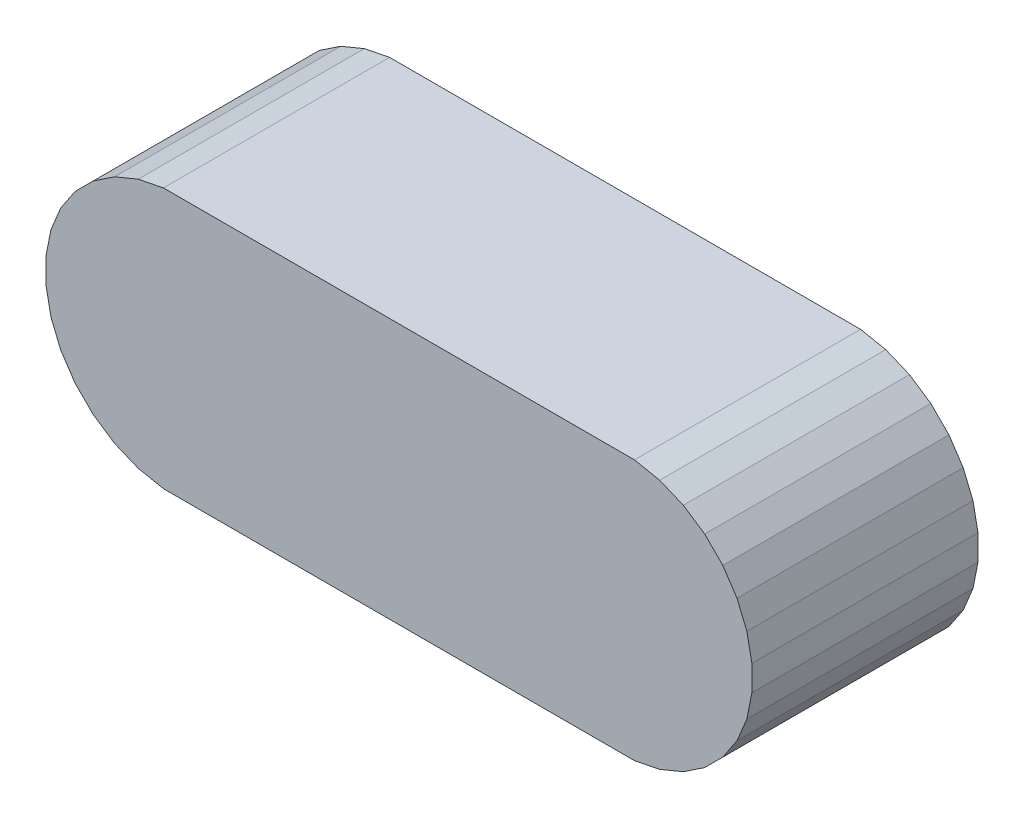
ISO-10303-21;
HEADER;
FILE_DESCRIPTION(('STEP AP214'),'2;1');
FILE_NAME('part.step','',(''),(''),'','','');
FILE_SCHEMA(('AUTOMOTIVE_DESIGN { 1 0 10303 214 1 1 1 1 }'));
ENDSEC;
DATA;
#1=APPLICATION_CONTEXT('core data for automotive mechanical design processes');
#2=APPLICATION_PROTOCOL_DEFINITION('international standard','automotive_design',2000,#1);
#3=PRODUCT_CONTEXT('',#1,'mechanical');
#4=PRODUCT('Part','Part','',(#3));
#5=PRODUCT_RELATED_PRODUCT_CATEGORY('part','',(#4));
#6=PRODUCT_DEFINITION_FORMATION('','',#4);
#7=PRODUCT_DEFINITION_CONTEXT('part definition',#1,'design');
#8=PRODUCT_DEFINITION('design','',#6,#7);
#9=PRODUCT_DEFINITION_SHAPE('','',#8);
#10=(LENGTH_UNIT() NAMED_UNIT(*) SI_UNIT(.MILLI.,.METRE.));
#11=(NAMED_UNIT(*) PLANE_ANGLE_UNIT() SI_UNIT($,.RADIAN.));
#12=(NAMED_UNIT(*) SI_UNIT($,.STERADIAN.) SOLID_ANGLE_UNIT());
#13=UNCERTAINTY_MEASURE_WITH_UNIT(LENGTH_MEASURE(1.E-05),#10,'distance_accuracy_value','');
#14=(GEOMETRIC_REPRESENTATION_CONTEXT(3) GLOBAL_UNCERTAINTY_ASSIGNED_CONTEXT((#13)) GLOBAL_UNIT_ASSIGNED_CONTEXT((#10,
#11,#12)) REPRESENTATION_CONTEXT('',''));
#15=CARTESIAN_POINT('',(0.,0.,0.));
#16=DIRECTION('',(0.,0.,1.));
#17=DIRECTION('',(1.,0.,0.));
#18=AXIS2_PLACEMENT_3D('',#15,#16,#17);
#19=CARTESIAN_POINT('',(-5.15050786,-0.1871853,0.));
#20=DIRECTION('',(-1.,0.,0.));
#21=DIRECTION('',(0.,0.,1.));
#22=AXIS2_PLACEMENT_3D('',#19,#20,#21);
#23=PLANE('',#22);
#24=DIRECTION('',(0.,0.,1.));
#25=VECTOR('',#24,1.);
#26=CARTESIAN_POINT('',(-5.15050786,0.18718276,0.));
#27=LINE('',#26,#25);
#28=CARTESIAN_POINT('',(-5.15050786,0.187182759999999,0.));
#29=VERTEX_POINT('',#28);
#30=CARTESIAN_POINT('',(-5.15050786,0.187182759999999,3.29999848));
#31=VERTEX_POINT('',#30);
#32=EDGE_CURVE('E258',#29,#31,#27,.T.);
#33=ORIENTED_EDGE('',*,*,#32,.F.);
#34=DIRECTION('',(0.,1.,0.));
#35=VECTOR('',#34,1.);
#36=CARTESIAN_POINT('',(-5.15050786,-0.1871853,0.));
#37=LINE('',#36,#35);
#38=CARTESIAN_POINT('',(-5.15050785999999,-0.187185299999999,0.));
#39=VERTEX_POINT('',#38);
#40=EDGE_CURVE('E235',#29,#39,#37,.F.);
#41=ORIENTED_EDGE('',*,*,#40,.T.);
#42=DIRECTION('',(0.,0.,1.));
#43=VECTOR('',#42,1.);
#44=CARTESIAN_POINT('',(-5.15050785999994,-0.187185299999988,0.));
#45=LINE('',#44,#43);
#46=CARTESIAN_POINT('',(-5.15050785999999,-0.1871853,3.29999848));
#47=VERTEX_POINT('',#46);
#48=EDGE_CURVE('E261',#47,#39,#45,.F.);
#49=ORIENTED_EDGE('',*,*,#48,.F.);
#50=DIRECTION('',(0.,1.,0.));
#51=VECTOR('',#50,1.);
#52=CARTESIAN_POINT('',(-5.15050786,-0.1871853,3.29999848));
#53=LINE('',#52,#51);
#54=EDGE_CURVE('E20',#47,#31,#53,.T.);
#55=ORIENTED_EDGE('',*,*,#54,.T.);
#56=EDGE_LOOP('',(#33,#41,#49,#55));
#57=FACE_BOUND('',#56,.T.);
#58=ADVANCED_FACE('F17',(#57),#23,.T.);
#59=CARTESIAN_POINT('',(5.15050786,0.18718276,0.));
#60=DIRECTION('',(1.,0.,0.));
#61=DIRECTION('',(0.,0.,-1.));
#62=AXIS2_PLACEMENT_3D('',#59,#60,#61);
#63=PLANE('',#62);
#64=DIRECTION('',(0.,1.,0.));
#65=VECTOR('',#64,1.);
#66=CARTESIAN_POINT('',(5.15050786,0.18718276,3.29999848));
#67=LINE('',#66,#65);
#68=CARTESIAN_POINT('',(5.15050785999999,0.187182759999994,3.29999848));
#69=VERTEX_POINT('',#68);
#70=CARTESIAN_POINT('',(5.15050786,-0.1871853,3.29999848));
#71=VERTEX_POINT('',#70);
#72=EDGE_CURVE('E225',#69,#71,#67,.F.);
#73=ORIENTED_EDGE('',*,*,#72,.T.);
#74=DIRECTION('',(0.,0.,1.));
#75=VECTOR('',#74,1.);
#76=CARTESIAN_POINT('',(5.15050786,-0.1871853,0.));
#77=LINE('',#76,#75);
#78=CARTESIAN_POINT('',(5.15050786,-0.1871853,0.));
#79=VERTEX_POINT('',#78);
#80=EDGE_CURVE('E229',#79,#71,#77,.T.);
#81=ORIENTED_EDGE('',*,*,#80,.F.);
#82=DIRECTION('',(0.,1.,0.));
#83=VECTOR('',#82,1.);
#84=CARTESIAN_POINT('',(5.15050786,0.18718276,0.));
#85=LINE('',#84,#83);
#86=CARTESIAN_POINT('',(5.15050785999999,0.187182759999996,0.));
#87=VERTEX_POINT('',#86);
#88=EDGE_CURVE('E220',#79,#87,#85,.T.);
#89=ORIENTED_EDGE('',*,*,#88,.T.);
#90=DIRECTION('',(0.,0.,1.));
#91=VECTOR('',#90,1.);
#92=CARTESIAN_POINT('',(5.15050785999995,0.18718275999999,0.));
#93=LINE('',#92,#91);
#94=EDGE_CURVE('E232',#69,#87,#93,.F.);
#95=ORIENTED_EDGE('',*,*,#94,.F.);
#96=EDGE_LOOP('',(#73,#81,#89,#95));
#97=FACE_BOUND('',#96,.T.);
#98=ADVANCED_FACE('F227',(#97),#63,.T.);
#99=CARTESIAN_POINT('',(5.15050786,-0.1871853,0.));
#100=DIRECTION('',(0.980783951239802,-0.195097004052961,0.));
#101=DIRECTION('',(0.195097004052961,0.980783951239802,0.));
#102=AXIS2_PLACEMENT_3D('',#99,#100,#101);
#103=PLANE('',#102);
#104=DIRECTION('',(0.,0.,1.));
#105=VECTOR('',#104,1.);
#106=CARTESIAN_POINT('',(5.07747016,-0.55435754,0.));
#107=LINE('',#106,#105);
#108=CARTESIAN_POINT('',(5.07747016000003,-0.554357540000005,0.));
#109=VERTEX_POINT('',#108);
#110=CARTESIAN_POINT('',(5.07747016000003,-0.554357540000005,3.29999848));
#111=VERTEX_POINT('',#110);
#112=EDGE_CURVE('E337',#109,#111,#107,.T.);
#113=ORIENTED_EDGE('',*,*,#112,.F.);
#114=DIRECTION('',(0.195097004052961,0.980783951239802,0.));
#115=VECTOR('',#114,1.);
#116=CARTESIAN_POINT('',(5.15050786,-0.1871853,0.));
#117=LINE('',#116,#115);
#118=EDGE_CURVE('E246',#109,#79,#117,.T.);
#119=ORIENTED_EDGE('',*,*,#118,.T.);
#120=ORIENTED_EDGE('',*,*,#80,.T.);
#121=DIRECTION('',(0.195097004052961,0.980783951239802,0.));
#122=VECTOR('',#121,1.);
#123=CARTESIAN_POINT('',(5.15050786,-0.1871853,3.29999848));
#124=LINE('',#123,#122);
#125=EDGE_CURVE('E238',#71,#111,#124,.F.);
#126=ORIENTED_EDGE('',*,*,#125,.T.);
#127=EDGE_LOOP('',(#113,#119,#120,#126));
#128=FACE_BOUND('',#127,.T.);
#129=ADVANCED_FACE('F248',(#128),#103,.T.);
#130=CARTESIAN_POINT('',(-5.0774727,-0.55435754,0.));
#131=DIRECTION('',(-0.980785249478325,-0.195090477486065,0.));
#132=DIRECTION('',(0.195090477486065,-0.980785249478325,0.));
#133=AXIS2_PLACEMENT_3D('',#130,#131,#132);
#134=PLANE('',#133);
#135=ORIENTED_EDGE('',*,*,#48,.T.);
#136=DIRECTION('',(0.195090477486065,-0.980785249478325,0.));
#137=VECTOR('',#136,1.);
#138=CARTESIAN_POINT('',(-5.0774727,-0.55435754,0.));
#139=LINE('',#138,#137);
#140=CARTESIAN_POINT('',(-5.07747269999998,-0.554357539999991,0.));
#141=VERTEX_POINT('',#140);
#142=EDGE_CURVE('E273',#39,#141,#139,.T.);
#143=ORIENTED_EDGE('',*,*,#142,.T.);
#144=DIRECTION('',(0.,0.,1.));
#145=VECTOR('',#144,1.);
#146=CARTESIAN_POINT('',(-5.07747269999991,-0.554357539999963,0.));
#147=LINE('',#146,#145);
#148=CARTESIAN_POINT('',(-5.07747269999998,-0.554357539999991,3.29999848));
#149=VERTEX_POINT('',#148);
#150=EDGE_CURVE('E284',#149,#141,#147,.F.);
#151=ORIENTED_EDGE('',*,*,#150,.F.);
#152=DIRECTION('',(0.195090477486065,-0.980785249478325,0.));
#153=VECTOR('',#152,1.);
#154=CARTESIAN_POINT('',(-5.0774727,-0.55435754,3.29999848));
#155=LINE('',#154,#153);
#156=EDGE_CURVE('E279',#149,#47,#155,.F.);
#157=ORIENTED_EDGE('',*,*,#156,.T.);
#158=EDGE_LOOP('',(#135,#143,#151,#157));
#159=FACE_BOUND('',#158,.T.);
#160=ADVANCED_FACE('F282',(#159),#134,.T.);
#161=CARTESIAN_POINT('',(-5.15050786,0.18718276,0.));
#162=DIRECTION('',(-0.980785249478325,0.195090477486065,0.));
#163=DIRECTION('',(-0.195090477486065,-0.980785249478325,0.));
#164=AXIS2_PLACEMENT_3D('',#161,#162,#163);
#165=PLANE('',#164);
#166=DIRECTION('',(0.,0.,1.));
#167=VECTOR('',#166,1.);
#168=CARTESIAN_POINT('',(-5.0774727,0.554355,0.));
#169=LINE('',#168,#167);
#170=CARTESIAN_POINT('',(-5.07747270000003,0.554355000000006,0.));
#171=VERTEX_POINT('',#170);
#172=CARTESIAN_POINT('',(-5.07747270000003,0.554355000000006,3.29999848));
#173=VERTEX_POINT('',#172);
#174=EDGE_CURVE('E330',#171,#173,#169,.T.);
#175=ORIENTED_EDGE('',*,*,#174,.F.);
#176=DIRECTION('',(-0.195090477486065,-0.980785249478325,0.));
#177=VECTOR('',#176,1.);
#178=CARTESIAN_POINT('',(-5.15050786,0.18718276,0.));
#179=LINE('',#178,#177);
#180=EDGE_CURVE('E270',#171,#29,#179,.T.);
#181=ORIENTED_EDGE('',*,*,#180,.T.);
#182=ORIENTED_EDGE('',*,*,#32,.T.);
#183=DIRECTION('',(-0.195090477486065,-0.980785249478325,0.));
#184=VECTOR('',#183,1.);
#185=CARTESIAN_POINT('',(-5.15050786,0.18718276,3.29999848));
#186=LINE('',#185,#184);
#187=EDGE_CURVE('E264',#31,#173,#186,.F.);
#188=ORIENTED_EDGE('',*,*,#187,.T.);
#189=EDGE_LOOP('',(#175,#181,#182,#188));
#190=FACE_BOUND('',#189,.T.);
#191=ADVANCED_FACE('F272',(#190),#165,.T.);
#192=CARTESIAN_POINT('',(5.07747016,0.554355,0.));
#193=DIRECTION('',(0.980783951239802,0.195097004052961,0.));
#194=DIRECTION('',(-0.195097004052961,0.980783951239802,0.));
#195=AXIS2_PLACEMENT_3D('',#192,#193,#194);
#196=PLANE('',#195);
#197=ORIENTED_EDGE('',*,*,#94,.T.);
#198=DIRECTION('',(-0.195097004052961,0.980783951239802,0.));
#199=VECTOR('',#198,1.);
#200=CARTESIAN_POINT('',(5.07747016,0.554355,0.));
#201=LINE('',#200,#199);
#202=CARTESIAN_POINT('',(5.07747015999998,0.554354999999991,0.));
#203=VERTEX_POINT('',#202);
#204=EDGE_CURVE('E339',#87,#203,#201,.T.);
#205=ORIENTED_EDGE('',*,*,#204,.T.);
#206=DIRECTION('',(0.,0.,1.));
#207=VECTOR('',#206,1.);
#208=CARTESIAN_POINT('',(5.07747015999991,0.554354999999963,0.));
#209=LINE('',#208,#207);
#210=CARTESIAN_POINT('',(5.07747015999998,0.554354999999992,3.29999848));
#211=VERTEX_POINT('',#210);
#212=EDGE_CURVE('E320',#211,#203,#209,.F.);
#213=ORIENTED_EDGE('',*,*,#212,.F.);
#214=DIRECTION('',(-0.195097004052961,0.980783951239802,0.));
#215=VECTOR('',#214,1.);
#216=CARTESIAN_POINT('',(5.07747016,0.554355,3.29999848));
#217=LINE('',#216,#215);
#218=EDGE_CURVE('E342',#211,#69,#217,.F.);
#219=ORIENTED_EDGE('',*,*,#218,.T.);
#220=EDGE_LOOP('',(#197,#205,#213,#219));
#221=FACE_BOUND('',#220,.T.);
#222=ADVANCED_FACE('F345',(#221),#196,.T.);
#223=CARTESIAN_POINT('',(5.07747016,-0.55435754,0.));
#224=DIRECTION('',(0.923880637834891,-0.382680763866955,0.));
#225=DIRECTION('',(0.382680763866955,0.923880637834891,0.));
#226=AXIS2_PLACEMENT_3D('',#223,#224,#225);
#227=PLANE('',#226);
#228=DIRECTION('',(0.,0.,1.));
#229=VECTOR('',#228,1.);
#230=CARTESIAN_POINT('',(4.93420654,-0.90022934,0.));
#231=LINE('',#230,#229);
#232=CARTESIAN_POINT('',(4.93420654000004,-0.900229340000018,0.));
#233=VERTEX_POINT('',#232);
#234=CARTESIAN_POINT('',(4.93420654000004,-0.900229340000018,3.29999848));
#235=VERTEX_POINT('',#234);
#236=EDGE_CURVE('E315',#233,#235,#231,.T.);
#237=ORIENTED_EDGE('',*,*,#236,.F.);
#238=DIRECTION('',(0.382680763866955,0.923880637834891,0.));
#239=VECTOR('',#238,1.);
#240=CARTESIAN_POINT('',(5.07747016,-0.55435754,0.));
#241=LINE('',#240,#239);
#242=EDGE_CURVE('E292',#233,#109,#241,.T.);
#243=ORIENTED_EDGE('',*,*,#242,.T.);
#244=ORIENTED_EDGE('',*,*,#112,.T.);
#245=DIRECTION('',(0.382680763866955,0.923880637834891,0.));
#246=VECTOR('',#245,1.);
#247=CARTESIAN_POINT('',(5.07747016,-0.55435754,3.29999848));
#248=LINE('',#247,#246);
#249=EDGE_CURVE('E242',#111,#235,#248,.F.);
#250=ORIENTED_EDGE('',*,*,#249,.T.);
#251=EDGE_LOOP('',(#237,#243,#244,#250));
#252=FACE_BOUND('',#251,.T.);
#253=ADVANCED_FACE('F587',(#252),#227,.T.);
#254=CARTESIAN_POINT('',(-4.93420908,-0.90022934,0.));
#255=DIRECTION('',(-0.923880637834891,-0.382680763866955,0.));
#256=DIRECTION('',(0.382680763866955,-0.923880637834891,0.));
#257=AXIS2_PLACEMENT_3D('',#254,#255,#256);
#258=PLANE('',#257);
#259=ORIENTED_EDGE('',*,*,#150,.T.);
#260=DIRECTION('',(0.382680763866955,-0.923880637834891,0.));
#261=VECTOR('',#260,1.);
#262=CARTESIAN_POINT('',(-4.93420908,-0.90022934,0.));
#263=LINE('',#262,#261);
#264=CARTESIAN_POINT('',(-4.93420907999997,-0.900229339999981,0.));
#265=VERTEX_POINT('',#264);
#266=EDGE_CURVE('E298',#141,#265,#263,.T.);
#267=ORIENTED_EDGE('',*,*,#266,.T.);
#268=DIRECTION('',(0.,0.,1.));
#269=VECTOR('',#268,1.);
#270=CARTESIAN_POINT('',(-4.93420907999989,-0.900229339999925,0.));
#271=LINE('',#270,#269);
#272=CARTESIAN_POINT('',(-4.93420907999997,-0.90022933999998,3.29999848));
#273=VERTEX_POINT('',#272);
#274=EDGE_CURVE('E295',#273,#265,#271,.F.);
#275=ORIENTED_EDGE('',*,*,#274,.F.);
#276=DIRECTION('',(0.382680763866955,-0.923880637834891,0.));
#277=VECTOR('',#276,1.);
#278=CARTESIAN_POINT('',(-4.93420908,-0.90022934,3.29999848));
#279=LINE('',#278,#277);
#280=EDGE_CURVE('E286',#273,#149,#279,.F.);
#281=ORIENTED_EDGE('',*,*,#280,.T.);
#282=EDGE_LOOP('',(#259,#267,#275,#281));
#283=FACE_BOUND('',#282,.T.);
#284=ADVANCED_FACE('F296',(#283),#258,.T.);
#285=CARTESIAN_POINT('',(-5.0774727,0.554355,0.));
#286=DIRECTION('',(-0.923880637834891,0.382680763866955,0.));
#287=DIRECTION('',(-0.382680763866955,-0.923880637834891,0.));
#288=AXIS2_PLACEMENT_3D('',#285,#286,#287);
#289=PLANE('',#288);
#290=DIRECTION('',(0.,0.,1.));
#291=VECTOR('',#290,1.);
#292=CARTESIAN_POINT('',(-4.93420908,0.9002268,0.));
#293=LINE('',#292,#291);
#294=CARTESIAN_POINT('',(-4.93420908000004,0.900226800000018,0.));
#295=VERTEX_POINT('',#294);
#296=CARTESIAN_POINT('',(-4.93420908000004,0.900226800000018,3.29999848));
#297=VERTEX_POINT('',#296);
#298=EDGE_CURVE('E371',#295,#297,#293,.T.);
#299=ORIENTED_EDGE('',*,*,#298,.F.);
#300=DIRECTION('',(-0.382680763866955,-0.923880637834891,0.));
#301=VECTOR('',#300,1.);
#302=CARTESIAN_POINT('',(-5.0774727,0.554355,0.));
#303=LINE('',#302,#301);
#304=EDGE_CURVE('E326',#295,#171,#303,.T.);
#305=ORIENTED_EDGE('',*,*,#304,.T.);
#306=ORIENTED_EDGE('',*,*,#174,.T.);
#307=DIRECTION('',(-0.382680763866955,-0.923880637834891,0.));
#308=VECTOR('',#307,1.);
#309=CARTESIAN_POINT('',(-5.0774727,0.554355,3.29999848));
#310=LINE('',#309,#308);
#311=EDGE_CURVE('E266',#173,#297,#310,.F.);
#312=ORIENTED_EDGE('',*,*,#311,.T.);
#313=EDGE_LOOP('',(#299,#305,#306,#312));
#314=FACE_BOUND('',#313,.T.);
#315=ADVANCED_FACE('F595',(#314),#289,.T.);
#316=CARTESIAN_POINT('',(4.93420654,0.9002268,0.));
#317=DIRECTION('',(0.923880637834891,0.382680763866955,0.));
#318=DIRECTION('',(-0.382680763866955,0.923880637834891,0.));
#319=AXIS2_PLACEMENT_3D('',#316,#317,#318);
#320=PLANE('',#319);
#321=ORIENTED_EDGE('',*,*,#212,.T.);
#322=DIRECTION('',(-0.382680763866955,0.923880637834891,0.));
#323=VECTOR('',#322,1.);
#324=CARTESIAN_POINT('',(4.93420654,0.9002268,0.));
#325=LINE('',#324,#323);
#326=CARTESIAN_POINT('',(4.93420653999997,0.90022679999998,0.));
#327=VERTEX_POINT('',#326);
#328=EDGE_CURVE('E318',#203,#327,#325,.T.);
#329=ORIENTED_EDGE('',*,*,#328,.T.);
#330=DIRECTION('',(0.,0.,1.));
#331=VECTOR('',#330,1.);
#332=CARTESIAN_POINT('',(4.93420653999989,0.900226799999925,0.));
#333=LINE('',#332,#331);
#334=CARTESIAN_POINT('',(4.93420653999997,0.90022679999998,3.29999848));
#335=VERTEX_POINT('',#334);
#336=EDGE_CURVE('E352',#335,#327,#333,.F.);
#337=ORIENTED_EDGE('',*,*,#336,.F.);
#338=DIRECTION('',(-0.382680763866955,0.923880637834891,0.));
#339=VECTOR('',#338,1.);
#340=CARTESIAN_POINT('',(4.93420654,0.9002268,3.29999848));
#341=LINE('',#340,#339);
#342=EDGE_CURVE('E323',#335,#211,#341,.F.);
#343=ORIENTED_EDGE('',*,*,#342,.T.);
#344=EDGE_LOOP('',(#321,#329,#337,#343));
#345=FACE_BOUND('',#344,.T.);
#346=ADVANCED_FACE('F353',(#345),#320,.T.);
#347=CARTESIAN_POINT('',(4.93420654,-0.90022934,0.));
#348=DIRECTION('',(0.831468433537705,-0.555571997161803,0.));
#349=DIRECTION('',(0.555571997161803,0.831468433537705,0.));
#350=AXIS2_PLACEMENT_3D('',#347,#348,#349);
#351=PLANE('',#350);
#352=DIRECTION('',(0.,0.,1.));
#353=VECTOR('',#352,1.);
#354=CARTESIAN_POINT('',(4.72621864,-1.2115038,0.));
#355=LINE('',#354,#353);
#356=CARTESIAN_POINT('',(4.72621864000006,-1.21150380000004,0.));
#357=VERTEX_POINT('',#356);
#358=CARTESIAN_POINT('',(4.72621864000006,-1.21150380000004,3.29999848));
#359=VERTEX_POINT('',#358);
#360=EDGE_CURVE('E395',#357,#359,#355,.T.);
#361=ORIENTED_EDGE('',*,*,#360,.F.);
#362=DIRECTION('',(0.555571997161803,0.831468433537705,0.));
#363=VECTOR('',#362,1.);
#364=CARTESIAN_POINT('',(4.93420654,-0.90022934,0.));
#365=LINE('',#364,#363);
#366=EDGE_CURVE('E307',#357,#233,#365,.T.);
#367=ORIENTED_EDGE('',*,*,#366,.T.);
#368=ORIENTED_EDGE('',*,*,#236,.T.);
#369=DIRECTION('',(0.555571997161803,0.831468433537705,0.));
#370=VECTOR('',#369,1.);
#371=CARTESIAN_POINT('',(4.93420654,-0.90022934,3.29999848));
#372=LINE('',#371,#370);
#373=EDGE_CURVE('E310',#235,#359,#372,.F.);
#374=ORIENTED_EDGE('',*,*,#373,.T.);
#375=EDGE_LOOP('',(#361,#367,#368,#374));
#376=FACE_BOUND('',#375,.T.);
#377=ADVANCED_FACE('F585',(#376),#351,.T.);
#378=CARTESIAN_POINT('',(-4.72622118,-1.2115038,0.));
#379=DIRECTION('',(-0.831468433537705,-0.555571997161803,0.));
#380=DIRECTION('',(0.555571997161803,-0.831468433537705,0.));
#381=AXIS2_PLACEMENT_3D('',#378,#379,#380);
#382=PLANE('',#381);
#383=ORIENTED_EDGE('',*,*,#274,.T.);
#384=DIRECTION('',(0.555571997161803,-0.831468433537705,0.));
#385=VECTOR('',#384,1.);
#386=CARTESIAN_POINT('',(-4.72622118,-1.2115038,0.));
#387=LINE('',#386,#385);
#388=CARTESIAN_POINT('',(-4.72622118,-1.2115038,0.));
#389=VERTEX_POINT('',#388);
#390=EDGE_CURVE('E301',#265,#389,#387,.T.);
#391=ORIENTED_EDGE('',*,*,#390,.T.);
#392=DIRECTION('',(0.,0.,1.));
#393=VECTOR('',#392,1.);
#394=CARTESIAN_POINT('',(-4.72622118,-1.2115038,0.));
#395=LINE('',#394,#393);
#396=CARTESIAN_POINT('',(-4.72622118,-1.2115038,3.29999848));
#397=VERTEX_POINT('',#396);
#398=EDGE_CURVE('E305',#397,#389,#395,.F.);
#399=ORIENTED_EDGE('',*,*,#398,.F.);
#400=DIRECTION('',(0.555571997161803,-0.831468433537705,0.));
#401=VECTOR('',#400,1.);
#402=CARTESIAN_POINT('',(-4.72622118,-1.2115038,3.29999848));
#403=LINE('',#402,#401);
#404=EDGE_CURVE('E289',#397,#273,#403,.F.);
#405=ORIENTED_EDGE('',*,*,#404,.T.);
#406=EDGE_LOOP('',(#383,#391,#399,#405));
#407=FACE_BOUND('',#406,.T.);
#408=ADVANCED_FACE('F303',(#407),#382,.T.);
#409=CARTESIAN_POINT('',(-4.93420908,0.9002268,0.));
#410=DIRECTION('',(-0.831468433537705,0.555571997161803,0.));
#411=DIRECTION('',(-0.555571997161803,-0.831468433537705,0.));
#412=AXIS2_PLACEMENT_3D('',#409,#410,#411);
#413=PLANE('',#412);
#414=DIRECTION('',(0.,0.,1.));
#415=VECTOR('',#414,1.);
#416=CARTESIAN_POINT('',(-4.72622118,1.21150126,0.));
#417=LINE('',#416,#415);
#418=CARTESIAN_POINT('',(-4.72622118000006,1.21150126000004,0.));
#419=VERTEX_POINT('',#418);
#420=CARTESIAN_POINT('',(-4.72622118000006,1.21150126000004,3.29999848));
#421=VERTEX_POINT('',#420);
#422=EDGE_CURVE('E382',#419,#421,#417,.T.);
#423=ORIENTED_EDGE('',*,*,#422,.F.);
#424=DIRECTION('',(-0.555571997161803,-0.831468433537705,0.));
#425=VECTOR('',#424,1.);
#426=CARTESIAN_POINT('',(-4.93420908,0.9002268,0.));
#427=LINE('',#426,#425);
#428=EDGE_CURVE('E363',#419,#295,#427,.T.);
#429=ORIENTED_EDGE('',*,*,#428,.T.);
#430=ORIENTED_EDGE('',*,*,#298,.T.);
#431=DIRECTION('',(-0.555571997161803,-0.831468433537705,0.));
#432=VECTOR('',#431,1.);
#433=CARTESIAN_POINT('',(-4.93420908,0.9002268,3.29999848));
#434=LINE('',#433,#432);
#435=EDGE_CURVE('E366',#297,#421,#434,.F.);
#436=ORIENTED_EDGE('',*,*,#435,.T.);
#437=EDGE_LOOP('',(#423,#429,#430,#436));
#438=FACE_BOUND('',#437,.T.);
#439=ADVANCED_FACE('F425',(#438),#413,.T.);
#440=CARTESIAN_POINT('',(4.72621864,1.21150126,0.));
#441=DIRECTION('',(0.831468433537705,0.555571997161803,0.));
#442=DIRECTION('',(-0.555571997161803,0.831468433537705,0.));
#443=AXIS2_PLACEMENT_3D('',#440,#441,#442);
#444=PLANE('',#443);
#445=ORIENTED_EDGE('',*,*,#336,.T.);
#446=DIRECTION('',(-0.555571997161803,0.831468433537705,0.));
#447=VECTOR('',#446,1.);
#448=CARTESIAN_POINT('',(4.72621864,1.21150126,0.));
#449=LINE('',#448,#447);
#450=CARTESIAN_POINT('',(4.72621864,1.21150126,0.));
#451=VERTEX_POINT('',#450);
#452=EDGE_CURVE('E357',#327,#451,#449,.T.);
#453=ORIENTED_EDGE('',*,*,#452,.T.);
#454=DIRECTION('',(0.,0.,1.));
#455=VECTOR('',#454,1.);
#456=CARTESIAN_POINT('',(4.72621864,1.21150126,0.));
#457=LINE('',#456,#455);
#458=CARTESIAN_POINT('',(4.72621864,1.21150126,3.29999848));
#459=VERTEX_POINT('',#458);
#460=EDGE_CURVE('E361',#459,#451,#457,.F.);
#461=ORIENTED_EDGE('',*,*,#460,.F.);
#462=DIRECTION('',(-0.555571997161803,0.831468433537705,0.));
#463=VECTOR('',#462,1.);
#464=CARTESIAN_POINT('',(4.72621864,1.21150126,3.29999848));
#465=LINE('',#464,#463);
#466=EDGE_CURVE('E348',#459,#335,#465,.F.);
#467=ORIENTED_EDGE('',*,*,#466,.T.);
#468=EDGE_LOOP('',(#445,#453,#461,#467));
#469=FACE_BOUND('',#468,.T.);
#470=ADVANCED_FACE('F359',(#469),#444,.T.);
#471=CARTESIAN_POINT('',(4.72621864,-1.2115038,0.));
#472=DIRECTION('',(0.707106781186548,-0.707106781186548,0.));
#473=DIRECTION('',(0.707106781186548,0.707106781186548,0.));
#474=AXIS2_PLACEMENT_3D('',#471,#472,#473);
#475=PLANE('',#474);
#476=DIRECTION('',(0.,0.,1.));
#477=VECTOR('',#476,1.);
#478=CARTESIAN_POINT('',(4.46150238,-1.47622006,0.));
#479=LINE('',#478,#477);
#480=CARTESIAN_POINT('',(4.46150238,-1.47622006,0.));
#481=VERTEX_POINT('',#480);
#482=CARTESIAN_POINT('',(4.46150238,-1.47622006,3.29999848));
#483=VERTEX_POINT('',#482);
#484=EDGE_CURVE('E405',#481,#483,#479,.T.);
#485=ORIENTED_EDGE('',*,*,#484,.F.);
#486=DIRECTION('',(0.707106781186548,0.707106781186548,0.));
#487=VECTOR('',#486,1.);
#488=CARTESIAN_POINT('',(4.72621864,-1.2115038,0.));
#489=LINE('',#488,#487);
#490=EDGE_CURVE('E387',#481,#357,#489,.T.);
#491=ORIENTED_EDGE('',*,*,#490,.T.);
#492=ORIENTED_EDGE('',*,*,#360,.T.);
#493=DIRECTION('',(0.707106781186548,0.707106781186548,0.));
#494=VECTOR('',#493,1.);
#495=CARTESIAN_POINT('',(4.72621864,-1.2115038,3.29999848));
#496=LINE('',#495,#494);
#497=EDGE_CURVE('E393',#359,#483,#496,.F.);
#498=ORIENTED_EDGE('',*,*,#497,.T.);
#499=EDGE_LOOP('',(#485,#491,#492,#498));
#500=FACE_BOUND('',#499,.T.);
#501=ADVANCED_FACE('F461',(#500),#475,.T.);
#502=CARTESIAN_POINT('',(-4.46150492,-1.47622006,0.));
#503=DIRECTION('',(-0.707106781186548,-0.707106781186548,0.));
#504=DIRECTION('',(0.707106781186548,-0.707106781186548,0.));
#505=AXIS2_PLACEMENT_3D('',#502,#503,#504);
#506=PLANE('',#505);
#507=ORIENTED_EDGE('',*,*,#398,.T.);
#508=DIRECTION('',(0.707106781186548,-0.707106781186548,0.));
#509=VECTOR('',#508,1.);
#510=CARTESIAN_POINT('',(-4.46150492,-1.47622006,0.));
#511=LINE('',#510,#509);
#512=CARTESIAN_POINT('',(-4.46150492000002,-1.47622006000003,0.));
#513=VERTEX_POINT('',#512);
#514=EDGE_CURVE('E375',#389,#513,#511,.T.);
#515=ORIENTED_EDGE('',*,*,#514,.T.);
#516=DIRECTION('',(0.,0.,1.));
#517=VECTOR('',#516,1.);
#518=CARTESIAN_POINT('',(-4.46150492000007,-1.47622006000011,0.));
#519=LINE('',#518,#517);
#520=CARTESIAN_POINT('',(-4.46150492000002,-1.47622006000003,3.29999848));
#521=VERTEX_POINT('',#520);
#522=EDGE_CURVE('E441',#521,#513,#519,.F.);
#523=ORIENTED_EDGE('',*,*,#522,.F.);
#524=DIRECTION('',(0.707106781186548,-0.707106781186548,0.));
#525=VECTOR('',#524,1.);
#526=CARTESIAN_POINT('',(-4.46150492,-1.47622006,3.29999848));
#527=LINE('',#526,#525);
#528=EDGE_CURVE('E385',#521,#397,#527,.F.);
#529=ORIENTED_EDGE('',*,*,#528,.T.);
#530=EDGE_LOOP('',(#507,#515,#523,#529));
#531=FACE_BOUND('',#530,.T.);
#532=ADVANCED_FACE('F384',(#531),#506,.T.);
#533=CARTESIAN_POINT('',(-4.72622118,1.21150126,0.));
#534=DIRECTION('',(-0.707106781186548,0.707106781186548,0.));
#535=DIRECTION('',(-0.707106781186548,-0.707106781186548,0.));
#536=AXIS2_PLACEMENT_3D('',#533,#534,#535);
#537=PLANE('',#536);
#538=DIRECTION('',(0.,0.,1.));
#539=VECTOR('',#538,1.);
#540=CARTESIAN_POINT('',(-4.46150492,1.47621752,0.));
#541=LINE('',#540,#539);
#542=CARTESIAN_POINT('',(-4.46150492,1.47621752,0.));
#543=VERTEX_POINT('',#542);
#544=CARTESIAN_POINT('',(-4.46150492,1.47621752,3.29999848));
#545=VERTEX_POINT('',#544);
#546=EDGE_CURVE('E436',#543,#545,#541,.T.);
#547=ORIENTED_EDGE('',*,*,#546,.F.);
#548=DIRECTION('',(-0.707106781186548,-0.707106781186548,0.));
#549=VECTOR('',#548,1.);
#550=CARTESIAN_POINT('',(-4.72622118,1.21150126,0.));
#551=LINE('',#550,#549);
#552=EDGE_CURVE('E410',#543,#419,#551,.T.);
#553=ORIENTED_EDGE('',*,*,#552,.T.);
#554=ORIENTED_EDGE('',*,*,#422,.T.);
#555=DIRECTION('',(-0.707106781186548,-0.707106781186548,0.));
#556=VECTOR('',#555,1.);
#557=CARTESIAN_POINT('',(-4.72622118,1.21150126,3.29999848));
#558=LINE('',#557,#556);
#559=EDGE_CURVE('E416',#421,#545,#558,.F.);
#560=ORIENTED_EDGE('',*,*,#559,.T.);
#561=EDGE_LOOP('',(#547,#553,#554,#560));
#562=FACE_BOUND('',#561,.T.);
#563=ADVANCED_FACE('F421',(#562),#537,.T.);
#564=CARTESIAN_POINT('',(4.46150238,1.47621752,0.));
#565=DIRECTION('',(0.707106781186548,0.707106781186548,0.));
#566=DIRECTION('',(-0.707106781186548,0.707106781186548,0.));
#567=AXIS2_PLACEMENT_3D('',#564,#565,#566);
#568=PLANE('',#567);
#569=ORIENTED_EDGE('',*,*,#460,.T.);
#570=DIRECTION('',(-0.707106781186548,0.707106781186548,0.));
#571=VECTOR('',#570,1.);
#572=CARTESIAN_POINT('',(4.46150238,1.47621752,0.));
#573=LINE('',#572,#571);
#574=CARTESIAN_POINT('',(4.46150238000002,1.47621752000003,0.));
#575=VERTEX_POINT('',#574);
#576=EDGE_CURVE('E399',#451,#575,#573,.T.);
#577=ORIENTED_EDGE('',*,*,#576,.T.);
#578=DIRECTION('',(0.,0.,1.));
#579=VECTOR('',#578,1.);
#580=CARTESIAN_POINT('',(4.46150238000008,1.47621752000011,0.));
#581=LINE('',#580,#579);
#582=CARTESIAN_POINT('',(4.46150238000002,1.47621752000003,3.29999848));
#583=VERTEX_POINT('',#582);
#584=EDGE_CURVE('E478',#583,#575,#581,.F.);
#585=ORIENTED_EDGE('',*,*,#584,.F.);
#586=DIRECTION('',(-0.707106781186548,0.707106781186548,0.));
#587=VECTOR('',#586,1.);
#588=CARTESIAN_POINT('',(4.46150238,1.47621752,3.29999848));
#589=LINE('',#588,#587);
#590=EDGE_CURVE('E408',#583,#459,#589,.F.);
#591=ORIENTED_EDGE('',*,*,#590,.T.);
#592=EDGE_LOOP('',(#569,#577,#585,#591));
#593=FACE_BOUND('',#592,.T.);
#594=ADVANCED_FACE('F407',(#593),#568,.T.);
#595=CARTESIAN_POINT('',(4.46150238,-1.47622006,0.));
#596=DIRECTION('',(0.555571997161803,-0.831468433537705,0.));
#597=DIRECTION('',(0.831468433537705,0.555571997161803,0.));
#598=AXIS2_PLACEMENT_3D('',#595,#596,#597);
#599=PLANE('',#598);
#600=DIRECTION('',(0.,0.,1.));
#601=VECTOR('',#600,1.);
#602=CARTESIAN_POINT('',(4.15022792,-1.68420796,0.));
#603=LINE('',#602,#601);
#604=CARTESIAN_POINT('',(4.15022791999996,-1.68420795999994,0.));
#605=VERTEX_POINT('',#604);
#606=CARTESIAN_POINT('',(4.15022791999996,-1.68420795999994,3.29999848));
#607=VERTEX_POINT('',#606);
#608=EDGE_CURVE('E473',#605,#607,#603,.T.);
#609=ORIENTED_EDGE('',*,*,#608,.F.);
#610=DIRECTION('',(0.831468433537705,0.555571997161803,0.));
#611=VECTOR('',#610,1.);
#612=CARTESIAN_POINT('',(4.46150238,-1.47622006,0.));
#613=LINE('',#612,#611);
#614=EDGE_CURVE('E449',#605,#481,#613,.T.);
#615=ORIENTED_EDGE('',*,*,#614,.T.);
#616=ORIENTED_EDGE('',*,*,#484,.T.);
#617=DIRECTION('',(0.831468433537705,0.555571997161803,0.));
#618=VECTOR('',#617,1.);
#619=CARTESIAN_POINT('',(4.46150238,-1.47622006,3.29999848));
#620=LINE('',#619,#618);
#621=EDGE_CURVE('E452',#483,#607,#620,.F.);
#622=ORIENTED_EDGE('',*,*,#621,.T.);
#623=EDGE_LOOP('',(#609,#615,#616,#622));
#624=FACE_BOUND('',#623,.T.);
#625=ADVANCED_FACE('F457',(#624),#599,.T.);
#626=CARTESIAN_POINT('',(-4.15023046,-1.68420796,0.));
#627=DIRECTION('',(-0.555571997161803,-0.831468433537705,0.));
#628=DIRECTION('',(0.831468433537705,-0.555571997161803,0.));
#629=AXIS2_PLACEMENT_3D('',#626,#627,#628);
#630=PLANE('',#629);
#631=ORIENTED_EDGE('',*,*,#522,.T.);
#632=DIRECTION('',(0.831468433537705,-0.555571997161803,0.));
#633=VECTOR('',#632,1.);
#634=CARTESIAN_POINT('',(-4.15023046,-1.68420796,0.));
#635=LINE('',#634,#633);
#636=CARTESIAN_POINT('',(-4.15023046000001,-1.68420796000002,0.));
#637=VERTEX_POINT('',#636);
#638=EDGE_CURVE('E378',#513,#637,#635,.T.);
#639=ORIENTED_EDGE('',*,*,#638,.T.);
#640=DIRECTION('',(0.,0.,1.));
#641=VECTOR('',#640,1.);
#642=CARTESIAN_POINT('',(-4.15023046000004,-1.68420796000009,0.));
#643=LINE('',#642,#641);
#644=CARTESIAN_POINT('',(-4.15023046000001,-1.68420796000002,3.29999848));
#645=VERTEX_POINT('',#644);
#646=EDGE_CURVE('E547',#645,#637,#643,.F.);
#647=ORIENTED_EDGE('',*,*,#646,.F.);
#648=DIRECTION('',(0.831468433537705,-0.555571997161803,0.));
#649=VECTOR('',#648,1.);
#650=CARTESIAN_POINT('',(-4.15023046,-1.68420796,3.29999848));
#651=LINE('',#650,#649);
#652=EDGE_CURVE('E446',#645,#521,#651,.F.);
#653=ORIENTED_EDGE('',*,*,#652,.T.);
#654=EDGE_LOOP('',(#631,#639,#647,#653));
#655=FACE_BOUND('',#654,.T.);
#656=ADVANCED_FACE('F558',(#655),#630,.T.);
#657=CARTESIAN_POINT('',(-4.46150492,1.47621752,0.));
#658=DIRECTION('',(-0.555571997161803,0.831468433537705,0.));
#659=DIRECTION('',(-0.831468433537705,-0.555571997161803,0.));
#660=AXIS2_PLACEMENT_3D('',#657,#658,#659);
#661=PLANE('',#660);
#662=DIRECTION('',(0.,0.,1.));
#663=VECTOR('',#662,1.);
#664=CARTESIAN_POINT('',(-4.15023046,1.68420542,0.));
#665=LINE('',#664,#663);
#666=CARTESIAN_POINT('',(-4.15023045999996,1.68420541999994,0.));
#667=VERTEX_POINT('',#666);
#668=CARTESIAN_POINT('',(-4.15023045999996,1.68420541999994,3.29999848));
#669=VERTEX_POINT('',#668);
#670=EDGE_CURVE('E543',#667,#669,#665,.T.);
#671=ORIENTED_EDGE('',*,*,#670,.F.);
#672=DIRECTION('',(-0.831468433537705,-0.555571997161803,0.));
#673=VECTOR('',#672,1.);
#674=CARTESIAN_POINT('',(-4.46150492,1.47621752,0.));
#675=LINE('',#674,#673);
#676=EDGE_CURVE('E435',#667,#543,#675,.T.);
#677=ORIENTED_EDGE('',*,*,#676,.T.);
#678=ORIENTED_EDGE('',*,*,#546,.T.);
#679=DIRECTION('',(-0.831468433537705,-0.555571997161803,0.));
#680=VECTOR('',#679,1.);
#681=CARTESIAN_POINT('',(-4.46150492,1.47621752,3.29999848));
#682=LINE('',#681,#680);
#683=EDGE_CURVE('E428',#545,#669,#682,.F.);
#684=ORIENTED_EDGE('',*,*,#683,.T.);
#685=EDGE_LOOP('',(#671,#677,#678,#684));
#686=FACE_BOUND('',#685,.T.);
#687=ADVANCED_FACE('F439',(#686),#661,.T.);
#688=CARTESIAN_POINT('',(4.15022792,1.68420542,0.));
#689=DIRECTION('',(0.555571997161803,0.831468433537705,0.));
#690=DIRECTION('',(-0.831468433537705,0.555571997161803,0.));
#691=AXIS2_PLACEMENT_3D('',#688,#689,#690);
#692=PLANE('',#691);
#693=ORIENTED_EDGE('',*,*,#584,.T.);
#694=DIRECTION('',(-0.831468433537705,0.555571997161803,0.));
#695=VECTOR('',#694,1.);
#696=CARTESIAN_POINT('',(4.15022792,1.68420542,0.));
#697=LINE('',#696,#695);
#698=CARTESIAN_POINT('',(4.15022792000001,1.68420542000002,0.));
#699=VERTEX_POINT('',#698);
#700=EDGE_CURVE('E401',#575,#699,#697,.T.);
#701=ORIENTED_EDGE('',*,*,#700,.T.);
#702=DIRECTION('',(0.,0.,1.));
#703=VECTOR('',#702,1.);
#704=CARTESIAN_POINT('',(4.15022792000004,1.68420542000009,0.));
#705=LINE('',#704,#703);
#706=CARTESIAN_POINT('',(4.15022792000001,1.68420542000002,3.29999848));
#707=VERTEX_POINT('',#706);
#708=EDGE_CURVE('E489',#707,#699,#705,.F.);
#709=ORIENTED_EDGE('',*,*,#708,.F.);
#710=DIRECTION('',(-0.831468433537705,0.555571997161803,0.));
#711=VECTOR('',#710,1.);
#712=CARTESIAN_POINT('',(4.15022792,1.68420542,3.29999848));
#713=LINE('',#712,#711);
#714=EDGE_CURVE('E483',#707,#583,#713,.F.);
#715=ORIENTED_EDGE('',*,*,#714,.T.);
#716=EDGE_LOOP('',(#693,#701,#709,#715));
#717=FACE_BOUND('',#716,.T.);
#718=ADVANCED_FACE('F487',(#717),#692,.T.);
#719=CARTESIAN_POINT('',(4.15022792,-1.68420796,0.));
#720=DIRECTION('',(0.382680763866955,-0.923880637834891,0.));
#721=DIRECTION('',(0.923880637834891,0.382680763866955,0.));
#722=AXIS2_PLACEMENT_3D('',#719,#720,#721);
#723=PLANE('',#722);
#724=DIRECTION('',(0.,0.,1.));
#725=VECTOR('',#724,1.);
#726=CARTESIAN_POINT('',(3.80435612,-1.82747158,0.));
#727=LINE('',#726,#725);
#728=CARTESIAN_POINT('',(3.80435611999998,-1.82747157999996,0.));
#729=VERTEX_POINT('',#728);
#730=CARTESIAN_POINT('',(3.80435611999998,-1.82747157999996,3.29999848));
#731=VERTEX_POINT('',#730);
#732=EDGE_CURVE('E536',#729,#731,#727,.T.);
#733=ORIENTED_EDGE('',*,*,#732,.F.);
#734=DIRECTION('',(0.923880637834891,0.382680763866955,0.));
#735=VECTOR('',#734,1.);
#736=CARTESIAN_POINT('',(4.15022792,-1.68420796,0.));
#737=LINE('',#736,#735);
#738=EDGE_CURVE('E472',#729,#605,#737,.T.);
#739=ORIENTED_EDGE('',*,*,#738,.T.);
#740=ORIENTED_EDGE('',*,*,#608,.T.);
#741=DIRECTION('',(0.923880637834891,0.382680763866955,0.));
#742=VECTOR('',#741,1.);
#743=CARTESIAN_POINT('',(4.15022792,-1.68420796,3.29999848));
#744=LINE('',#743,#742);
#745=EDGE_CURVE('E465',#607,#731,#744,.F.);
#746=ORIENTED_EDGE('',*,*,#745,.T.);
#747=EDGE_LOOP('',(#733,#739,#740,#746));
#748=FACE_BOUND('',#747,.T.);
#749=ADVANCED_FACE('F476',(#748),#723,.T.);
#750=CARTESIAN_POINT('',(-3.80435866,-1.82747158,0.));
#751=DIRECTION('',(-0.382680763866955,-0.923880637834891,0.));
#752=DIRECTION('',(0.923880637834891,-0.382680763866955,0.));
#753=AXIS2_PLACEMENT_3D('',#750,#751,#752);
#754=PLANE('',#753);
#755=ORIENTED_EDGE('',*,*,#646,.T.);
#756=DIRECTION('',(0.923880637834891,-0.382680763866955,0.));
#757=VECTOR('',#756,1.);
#758=CARTESIAN_POINT('',(-3.80435866,-1.82747158,0.));
#759=LINE('',#758,#757);
#760=CARTESIAN_POINT('',(-3.80435866,-1.82747158000001,0.));
#761=VERTEX_POINT('',#760);
#762=EDGE_CURVE('E545',#637,#761,#759,.T.);
#763=ORIENTED_EDGE('',*,*,#762,.T.);
#764=DIRECTION('',(0.,0.,1.));
#765=VECTOR('',#764,1.);
#766=CARTESIAN_POINT('',(-3.80435866000001,-1.82747158000006,0.));
#767=LINE('',#766,#765);
#768=CARTESIAN_POINT('',(-3.80435866,-1.82747158000001,3.29999848));
#769=VERTEX_POINT('',#768);
#770=EDGE_CURVE('E526',#769,#761,#767,.F.);
#771=ORIENTED_EDGE('',*,*,#770,.F.);
#772=DIRECTION('',(0.923880637834891,-0.382680763866955,0.));
#773=VECTOR('',#772,1.);
#774=CARTESIAN_POINT('',(-3.80435866,-1.82747158,3.29999848));
#775=LINE('',#774,#773);
#776=EDGE_CURVE('E550',#769,#645,#775,.F.);
#777=ORIENTED_EDGE('',*,*,#776,.T.);
#778=EDGE_LOOP('',(#755,#763,#771,#777));
#779=FACE_BOUND('',#778,.T.);
#780=ADVANCED_FACE('F554',(#779),#754,.T.);
#781=CARTESIAN_POINT('',(-4.15023046,1.68420542,0.));
#782=DIRECTION('',(-0.382680763866955,0.923880637834891,0.));
#783=DIRECTION('',(-0.923880637834891,-0.382680763866955,0.));
#784=AXIS2_PLACEMENT_3D('',#781,#782,#783);
#785=PLANE('',#784);
#786=DIRECTION('',(0.,0.,1.));
#787=VECTOR('',#786,1.);
#788=CARTESIAN_POINT('',(-3.80435866,1.82746904,0.));
#789=LINE('',#788,#787);
#790=CARTESIAN_POINT('',(-3.80435865999998,1.82746903999996,0.));
#791=VERTEX_POINT('',#790);
#792=CARTESIAN_POINT('',(-3.80435865999998,1.82746903999995,3.29999848));
#793=VERTEX_POINT('',#792);
#794=EDGE_CURVE('E521',#791,#793,#789,.T.);
#795=ORIENTED_EDGE('',*,*,#794,.F.);
#796=DIRECTION('',(-0.923880637834891,-0.382680763866955,0.));
#797=VECTOR('',#796,1.);
#798=CARTESIAN_POINT('',(-4.15023046,1.68420542,0.));
#799=LINE('',#798,#797);
#800=EDGE_CURVE('E498',#791,#667,#799,.T.);
#801=ORIENTED_EDGE('',*,*,#800,.T.);
#802=ORIENTED_EDGE('',*,*,#670,.T.);
#803=DIRECTION('',(-0.923880637834891,-0.382680763866955,0.));
#804=VECTOR('',#803,1.);
#805=CARTESIAN_POINT('',(-4.15023046,1.68420542,3.29999848));
#806=LINE('',#805,#804);
#807=EDGE_CURVE('E431',#669,#793,#806,.F.);
#808=ORIENTED_EDGE('',*,*,#807,.T.);
#809=EDGE_LOOP('',(#795,#801,#802,#808));
#810=FACE_BOUND('',#809,.T.);
#811=ADVANCED_FACE('F621',(#810),#785,.T.);
#812=CARTESIAN_POINT('',(3.80435612,1.82746904,0.));
#813=DIRECTION('',(0.382680763866955,0.923880637834891,0.));
#814=DIRECTION('',(-0.923880637834891,0.382680763866955,0.));
#815=AXIS2_PLACEMENT_3D('',#812,#813,#814);
#816=PLANE('',#815);
#817=ORIENTED_EDGE('',*,*,#708,.T.);
#818=DIRECTION('',(-0.923880637834891,0.382680763866955,0.));
#819=VECTOR('',#818,1.);
#820=CARTESIAN_POINT('',(3.80435612,1.82746904,0.));
#821=LINE('',#820,#819);
#822=CARTESIAN_POINT('',(3.80435612,1.82746904000001,0.));
#823=VERTEX_POINT('',#822);
#824=EDGE_CURVE('E503',#699,#823,#821,.T.);
#825=ORIENTED_EDGE('',*,*,#824,.T.);
#826=DIRECTION('',(0.,0.,1.));
#827=VECTOR('',#826,1.);
#828=CARTESIAN_POINT('',(3.80435612000001,1.82746904000005,0.));
#829=LINE('',#828,#827);
#830=CARTESIAN_POINT('',(3.80435612,1.82746904000001,3.29999848));
#831=VERTEX_POINT('',#830);
#832=EDGE_CURVE('E501',#831,#823,#829,.F.);
#833=ORIENTED_EDGE('',*,*,#832,.F.);
#834=DIRECTION('',(-0.923880637834891,0.382680763866955,0.));
#835=VECTOR('',#834,1.);
#836=CARTESIAN_POINT('',(3.80435612,1.82746904,3.29999848));
#837=LINE('',#836,#835);
#838=EDGE_CURVE('E492',#831,#707,#837,.F.);
#839=ORIENTED_EDGE('',*,*,#838,.T.);
#840=EDGE_LOOP('',(#817,#825,#833,#839));
#841=FACE_BOUND('',#840,.T.);
#842=ADVANCED_FACE('F502',(#841),#816,.T.);
#843=CARTESIAN_POINT('',(3.80435612,-1.82747158,0.));
#844=DIRECTION('',(0.195090477486065,-0.980785249478325,0.));
#845=DIRECTION('',(0.980785249478325,0.195090477486065,0.));
#846=AXIS2_PLACEMENT_3D('',#843,#844,#845);
#847=PLANE('',#846);
#848=DIRECTION('',(0.,0.,-1.));
#849=VECTOR('',#848,1.);
#850=CARTESIAN_POINT('',(3.43718388,-1.90050674,0.));
#851=LINE('',#850,#849);
#852=CARTESIAN_POINT('',(3.43718387999999,-1.90050673999997,0.));
#853=VERTEX_POINT('',#852);
#854=CARTESIAN_POINT('',(3.43718387999999,-1.90050673999997,3.29999848));
#855=VERTEX_POINT('',#854);
#856=EDGE_CURVE('E565',#853,#855,#851,.F.);
#857=ORIENTED_EDGE('',*,*,#856,.F.);
#858=DIRECTION('',(0.980785249478325,0.195090477486065,0.));
#859=VECTOR('',#858,1.);
#860=CARTESIAN_POINT('',(3.80435612,-1.82747158,0.));
#861=LINE('',#860,#859);
#862=EDGE_CURVE('E532',#853,#729,#861,.T.);
#863=ORIENTED_EDGE('',*,*,#862,.T.);
#864=ORIENTED_EDGE('',*,*,#732,.T.);
#865=DIRECTION('',(0.980785249478325,0.195090477486065,0.));
#866=VECTOR('',#865,1.);
#867=CARTESIAN_POINT('',(3.80435612,-1.82747158,3.29999848));
#868=LINE('',#867,#866);
#869=EDGE_CURVE('E468',#731,#855,#868,.F.);
#870=ORIENTED_EDGE('',*,*,#869,.T.);
#871=EDGE_LOOP('',(#857,#863,#864,#870));
#872=FACE_BOUND('',#871,.T.);
#873=ADVANCED_FACE('F581',(#872),#847,.T.);
#874=CARTESIAN_POINT('',(-3.43718642,-1.90050674,0.));
#875=DIRECTION('',(-0.195090477486065,-0.980785249478325,0.));
#876=DIRECTION('',(0.980785249478325,-0.195090477486065,0.));
#877=AXIS2_PLACEMENT_3D('',#874,#875,#876);
#878=PLANE('',#877);
#879=ORIENTED_EDGE('',*,*,#770,.T.);
#880=DIRECTION('',(0.980785249478325,-0.195090477486065,0.));
#881=VECTOR('',#880,1.);
#882=CARTESIAN_POINT('',(-3.43718642,-1.90050674,0.));
#883=LINE('',#882,#881);
#884=CARTESIAN_POINT('',(-3.43718642,-1.90050674,0.));
#885=VERTEX_POINT('',#884);
#886=EDGE_CURVE('E524',#761,#885,#883,.T.);
#887=ORIENTED_EDGE('',*,*,#886,.T.);
#888=DIRECTION('',(0.,0.,-1.));
#889=VECTOR('',#888,1.);
#890=CARTESIAN_POINT('',(-3.43718642,-1.90050674,0.));
#891=LINE('',#890,#889);
#892=CARTESIAN_POINT('',(-3.43718642,-1.90050674,3.29999848));
#893=VERTEX_POINT('',#892);
#894=EDGE_CURVE('E562',#893,#885,#891,.T.);
#895=ORIENTED_EDGE('',*,*,#894,.F.);
#896=DIRECTION('',(0.980785249478325,-0.195090477486065,0.));
#897=VECTOR('',#896,1.);
#898=CARTESIAN_POINT('',(-3.43718642,-1.90050674,3.29999848));
#899=LINE('',#898,#897);
#900=EDGE_CURVE('E529',#893,#769,#899,.F.);
#901=ORIENTED_EDGE('',*,*,#900,.T.);
#902=EDGE_LOOP('',(#879,#887,#895,#901));
#903=FACE_BOUND('',#902,.T.);
#904=ADVANCED_FACE('F561',(#903),#878,.T.);
#905=CARTESIAN_POINT('',(-3.80435866,1.82746904,0.));
#906=DIRECTION('',(-0.195097004052961,0.980783951239802,0.));
#907=DIRECTION('',(-0.980783951239802,-0.195097004052961,0.));
#908=AXIS2_PLACEMENT_3D('',#905,#906,#907);
#909=PLANE('',#908);
#910=DIRECTION('',(0.,0.,1.));
#911=VECTOR('',#910,1.);
#912=CARTESIAN_POINT('',(-3.43718642,1.90050674,0.));
#913=LINE('',#912,#911);
#914=CARTESIAN_POINT('',(-3.43718641999999,1.90050673999997,0.));
#915=VERTEX_POINT('',#914);
#916=CARTESIAN_POINT('',(-3.43718641999999,1.90050673999997,3.29999848));
#917=VERTEX_POINT('',#916);
#918=EDGE_CURVE('E564',#915,#917,#913,.T.);
#919=ORIENTED_EDGE('',*,*,#918,.F.);
#920=DIRECTION('',(-0.980783951239802,-0.195097004052961,0.));
#921=VECTOR('',#920,1.);
#922=CARTESIAN_POINT('',(-3.80435866,1.82746904,0.));
#923=LINE('',#922,#921);
#924=EDGE_CURVE('E512',#915,#791,#923,.T.);
#925=ORIENTED_EDGE('',*,*,#924,.T.);
#926=ORIENTED_EDGE('',*,*,#794,.T.);
#927=DIRECTION('',(-0.980783951239802,-0.195097004052961,0.));
#928=VECTOR('',#927,1.);
#929=CARTESIAN_POINT('',(-3.80435866,1.82746904,3.29999848));
#930=LINE('',#929,#928);
#931=EDGE_CURVE('E515',#793,#917,#930,.F.);
#932=ORIENTED_EDGE('',*,*,#931,.T.);
#933=EDGE_LOOP('',(#919,#925,#926,#932));
#934=FACE_BOUND('',#933,.T.);
#935=ADVANCED_FACE('F611',(#934),#909,.T.);
#936=CARTESIAN_POINT('',(3.43718388,1.90050674,0.));
#937=DIRECTION('',(0.195097004052961,0.980783951239802,0.));
#938=DIRECTION('',(-0.980783951239802,0.195097004052961,0.));
#939=AXIS2_PLACEMENT_3D('',#936,#937,#938);
#940=PLANE('',#939);
#941=ORIENTED_EDGE('',*,*,#832,.T.);
#942=DIRECTION('',(-0.980783951239802,0.195097004052961,0.));
#943=VECTOR('',#942,1.);
#944=CARTESIAN_POINT('',(3.43718388,1.90050674,0.));
#945=LINE('',#944,#943);
#946=CARTESIAN_POINT('',(3.43718388,1.90050674,0.));
#947=VERTEX_POINT('',#946);
#948=EDGE_CURVE('E507',#823,#947,#945,.T.);
#949=ORIENTED_EDGE('',*,*,#948,.T.);
#950=DIRECTION('',(0.,0.,1.));
#951=VECTOR('',#950,1.);
#952=CARTESIAN_POINT('',(3.43718388,1.90050674,0.));
#953=LINE('',#952,#951);
#954=CARTESIAN_POINT('',(3.43718388,1.90050674,3.29999848));
#955=VERTEX_POINT('',#954);
#956=EDGE_CURVE('E511',#955,#947,#953,.F.);
#957=ORIENTED_EDGE('',*,*,#956,.F.);
#958=DIRECTION('',(-0.980783951239802,0.195097004052961,0.));
#959=VECTOR('',#958,1.);
#960=CARTESIAN_POINT('',(3.43718388,1.90050674,3.29999848));
#961=LINE('',#960,#959);
#962=EDGE_CURVE('E495',#955,#831,#961,.F.);
#963=ORIENTED_EDGE('',*,*,#962,.T.);
#964=EDGE_LOOP('',(#941,#949,#957,#963));
#965=FACE_BOUND('',#964,.T.);
#966=ADVANCED_FACE('F509',(#965),#940,.T.);
#967=CARTESIAN_POINT('',(-3.25000112,-1.90050674,0.));
#968=DIRECTION('',(0.,0.,1.));
#969=DIRECTION('',(1.,0.,0.));
#970=AXIS2_PLACEMENT_3D('',#967,#968,#969);
#971=PLANE('',#970);
#972=ORIENTED_EDGE('',*,*,#886,.F.);
#973=ORIENTED_EDGE('',*,*,#762,.F.);
#974=ORIENTED_EDGE('',*,*,#638,.F.);
#975=ORIENTED_EDGE('',*,*,#514,.F.);
#976=ORIENTED_EDGE('',*,*,#390,.F.);
#977=ORIENTED_EDGE('',*,*,#266,.F.);
#978=ORIENTED_EDGE('',*,*,#142,.F.);
#979=ORIENTED_EDGE('',*,*,#40,.F.);
#980=ORIENTED_EDGE('',*,*,#180,.F.);
#981=ORIENTED_EDGE('',*,*,#304,.F.);
#982=ORIENTED_EDGE('',*,*,#428,.F.);
#983=ORIENTED_EDGE('',*,*,#552,.F.);
#984=ORIENTED_EDGE('',*,*,#676,.F.);
#985=ORIENTED_EDGE('',*,*,#800,.F.);
#986=ORIENTED_EDGE('',*,*,#924,.F.);
#987=DIRECTION('',(1.,0.,0.));
#988=VECTOR('',#987,1.);
#989=CARTESIAN_POINT('',(-3.25000112,1.90050674,0.));
#990=LINE('',#989,#988);
#991=EDGE_CURVE('E574',#947,#915,#990,.F.);
#992=ORIENTED_EDGE('',*,*,#991,.F.);
#993=ORIENTED_EDGE('',*,*,#948,.F.);
#994=ORIENTED_EDGE('',*,*,#824,.F.);
#995=ORIENTED_EDGE('',*,*,#700,.F.);
#996=ORIENTED_EDGE('',*,*,#576,.F.);
#997=ORIENTED_EDGE('',*,*,#452,.F.);
#998=ORIENTED_EDGE('',*,*,#328,.F.);
#999=ORIENTED_EDGE('',*,*,#204,.F.);
#1000=ORIENTED_EDGE('',*,*,#88,.F.);
#1001=ORIENTED_EDGE('',*,*,#118,.F.);
#1002=ORIENTED_EDGE('',*,*,#242,.F.);
#1003=ORIENTED_EDGE('',*,*,#366,.F.);
#1004=ORIENTED_EDGE('',*,*,#490,.F.);
#1005=ORIENTED_EDGE('',*,*,#614,.F.);
#1006=ORIENTED_EDGE('',*,*,#738,.F.);
#1007=ORIENTED_EDGE('',*,*,#862,.F.);
#1008=DIRECTION('',(1.,0.,0.));
#1009=VECTOR('',#1008,1.);
#1010=CARTESIAN_POINT('',(3.25000112,-1.90050674,0.));
#1011=LINE('',#1010,#1009);
#1012=EDGE_CURVE('E35',#885,#853,#1011,.T.);
#1013=ORIENTED_EDGE('',*,*,#1012,.F.);
#1014=EDGE_LOOP('',(#972,#973,#974,#975,#976,#977,#978,#979,#980,#981,#982,#983,#984,#985,#986,
#992,#993,#994,#995,#996,#997,#998,#999,#1000,#1001,#1002,#1003,#1004,#1005,#1006,#1007,#1013));
#1015=FACE_BOUND('',#1014,.T.);
#1016=ADVANCED_FACE('F376',(#1015),#971,.F.);
#1017=CARTESIAN_POINT('',(3.25000112,-1.90050674,0.));
#1018=DIRECTION('',(0.,-1.,0.));
#1019=DIRECTION('',(0.,0.,-1.));
#1020=AXIS2_PLACEMENT_3D('',#1017,#1018,#1019);
#1021=PLANE('',#1020);
#1022=DIRECTION('',(1.,0.,0.));
#1023=VECTOR('',#1022,1.);
#1024=CARTESIAN_POINT('',(-3.25000112,-1.90050674,3.29999848));
#1025=LINE('',#1024,#1023);
#1026=EDGE_CURVE('E26',#893,#855,#1025,.T.);
#1027=ORIENTED_EDGE('',*,*,#1026,.F.);
#1028=ORIENTED_EDGE('',*,*,#894,.T.);
#1029=ORIENTED_EDGE('',*,*,#1012,.T.);
#1030=ORIENTED_EDGE('',*,*,#856,.T.);
#1031=EDGE_LOOP('',(#1027,#1028,#1029,#1030));
#1032=FACE_BOUND('',#1031,.T.);
#1033=ADVANCED_FACE('F582',(#1032),#1021,.T.);
#1034=CARTESIAN_POINT('',(-3.25000112,1.90050674,0.));
#1035=DIRECTION('',(0.,1.,0.));
#1036=DIRECTION('',(0.,0.,1.));
#1037=AXIS2_PLACEMENT_3D('',#1034,#1035,#1036);
#1038=PLANE('',#1037);
#1039=DIRECTION('',(1.,0.,0.));
#1040=VECTOR('',#1039,1.);
#1041=CARTESIAN_POINT('',(-3.25000112,1.90050674,3.29999848));
#1042=LINE('',#1041,#1040);
#1043=EDGE_CURVE('E11',#955,#917,#1042,.F.);
#1044=ORIENTED_EDGE('',*,*,#1043,.F.);
#1045=ORIENTED_EDGE('',*,*,#956,.T.);
#1046=ORIENTED_EDGE('',*,*,#991,.T.);
#1047=ORIENTED_EDGE('',*,*,#918,.T.);
#1048=EDGE_LOOP('',(#1044,#1045,#1046,#1047));
#1049=FACE_BOUND('',#1048,.T.);
#1050=ADVANCED_FACE('F573',(#1049),#1038,.T.);
#1051=CARTESIAN_POINT('',(-3.25000112,-1.90050674,3.29999848));
#1052=DIRECTION('',(0.,0.,1.));
#1053=DIRECTION('',(1.,0.,0.));
#1054=AXIS2_PLACEMENT_3D('',#1051,#1052,#1053);
#1055=PLANE('',#1054);
#1056=ORIENTED_EDGE('',*,*,#900,.F.);
#1057=ORIENTED_EDGE('',*,*,#1026,.T.);
#1058=ORIENTED_EDGE('',*,*,#869,.F.);
#1059=ORIENTED_EDGE('',*,*,#745,.F.);
#1060=ORIENTED_EDGE('',*,*,#621,.F.);
#1061=ORIENTED_EDGE('',*,*,#497,.F.);
#1062=ORIENTED_EDGE('',*,*,#373,.F.);
#1063=ORIENTED_EDGE('',*,*,#249,.F.);
#1064=ORIENTED_EDGE('',*,*,#125,.F.);
#1065=ORIENTED_EDGE('',*,*,#72,.F.);
#1066=ORIENTED_EDGE('',*,*,#218,.F.);
#1067=ORIENTED_EDGE('',*,*,#342,.F.);
#1068=ORIENTED_EDGE('',*,*,#466,.F.);
#1069=ORIENTED_EDGE('',*,*,#590,.F.);
#1070=ORIENTED_EDGE('',*,*,#714,.F.);
#1071=ORIENTED_EDGE('',*,*,#838,.F.);
#1072=ORIENTED_EDGE('',*,*,#962,.F.);
#1073=ORIENTED_EDGE('',*,*,#1043,.T.);
#1074=ORIENTED_EDGE('',*,*,#931,.F.);
#1075=ORIENTED_EDGE('',*,*,#807,.F.);
#1076=ORIENTED_EDGE('',*,*,#683,.F.);
#1077=ORIENTED_EDGE('',*,*,#559,.F.);
#1078=ORIENTED_EDGE('',*,*,#435,.F.);
#1079=ORIENTED_EDGE('',*,*,#311,.F.);
#1080=ORIENTED_EDGE('',*,*,#187,.F.);
#1081=ORIENTED_EDGE('',*,*,#54,.F.);
#1082=ORIENTED_EDGE('',*,*,#156,.F.);
#1083=ORIENTED_EDGE('',*,*,#280,.F.);
#1084=ORIENTED_EDGE('',*,*,#404,.F.);
#1085=ORIENTED_EDGE('',*,*,#528,.F.);
#1086=ORIENTED_EDGE('',*,*,#652,.F.);
#1087=ORIENTED_EDGE('',*,*,#776,.F.);
#1088=EDGE_LOOP('',(#1056,#1057,#1058,#1059,#1060,#1061,#1062,#1063,#1064,#1065,#1066,#1067,
#1068,#1069,#1070,#1071,#1072,#1073,#1074,#1075,#1076,#1077,#1078,#1079,#1080,#1081,#1082,#1083,
#1084,#1085,#1086,#1087));
#1089=FACE_BOUND('',#1088,.T.);
#1090=ADVANCED_FACE('F240',(#1089),#1055,.T.);
#1091=CLOSED_SHELL('',(#58,#98,#129,#160,#191,#222,#253,#284,#315,#346,#377,#408,#439,#470,#501,
#532,#563,#594,#625,#656,#687,#718,#749,#780,#811,#842,#873,#904,#935,#966,#1016,#1033,#1050,#1090));
#1092=MANIFOLD_SOLID_BREP('B1',#1091);
#1093=ADVANCED_BREP_SHAPE_REPRESENTATION('',(#18,#1092),#14);
#1094=SHAPE_DEFINITION_REPRESENTATION(#9,#1093);
ENDSEC;
END-ISO-10303-21;
